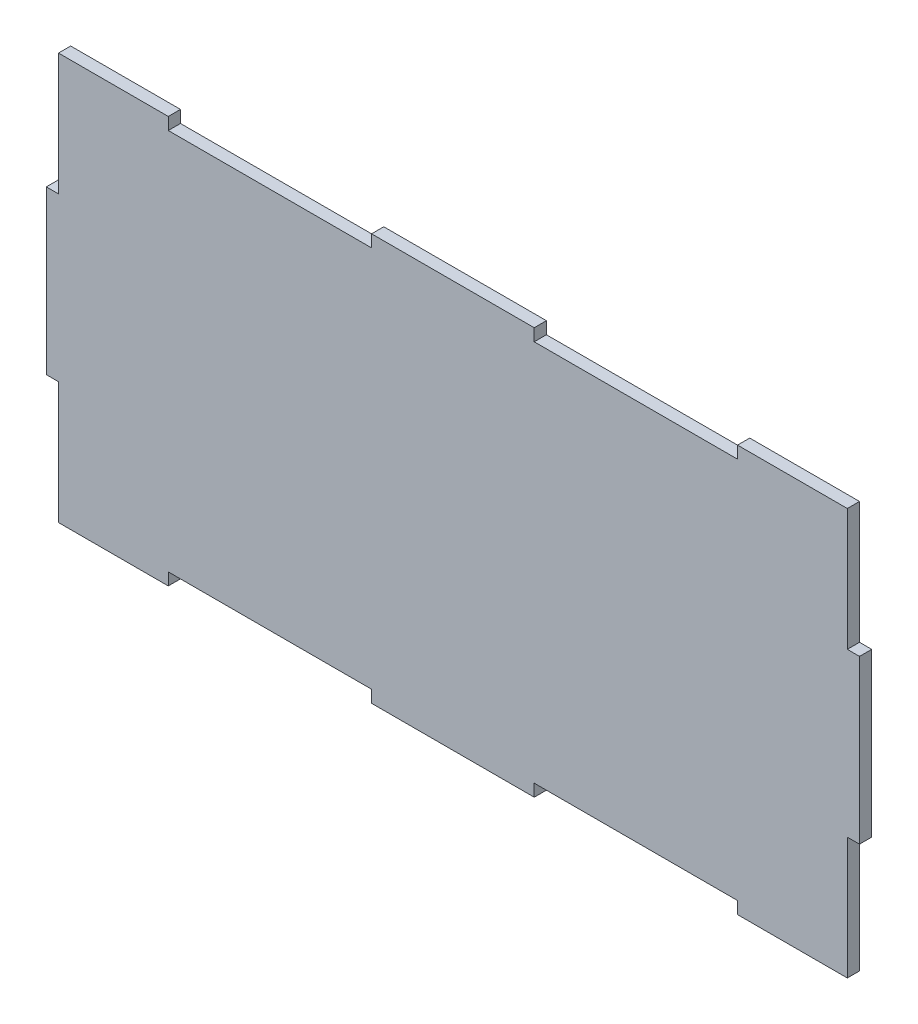
ISO-10303-21;
HEADER;
FILE_DESCRIPTION(('STEP AP214'),'2;1');
FILE_NAME('part.step','',(''),(''),'','','');
FILE_SCHEMA(('AUTOMOTIVE_DESIGN { 1 0 10303 214 1 1 1 1 }'));
ENDSEC;
DATA;
#1=APPLICATION_CONTEXT('core data for automotive mechanical design processes');
#2=APPLICATION_PROTOCOL_DEFINITION('international standard','automotive_design',2000,#1);
#3=PRODUCT_CONTEXT('',#1,'mechanical');
#4=PRODUCT('Part','Part','',(#3));
#5=PRODUCT_RELATED_PRODUCT_CATEGORY('part','',(#4));
#6=PRODUCT_DEFINITION_FORMATION('','',#4);
#7=PRODUCT_DEFINITION_CONTEXT('part definition',#1,'design');
#8=PRODUCT_DEFINITION('design','',#6,#7);
#9=PRODUCT_DEFINITION_SHAPE('','',#8);
#10=(LENGTH_UNIT() NAMED_UNIT(*) SI_UNIT(.MILLI.,.METRE.));
#11=(NAMED_UNIT(*) PLANE_ANGLE_UNIT() SI_UNIT($,.RADIAN.));
#12=(NAMED_UNIT(*) SI_UNIT($,.STERADIAN.) SOLID_ANGLE_UNIT());
#13=UNCERTAINTY_MEASURE_WITH_UNIT(LENGTH_MEASURE(1.E-05),#10,'distance_accuracy_value','');
#14=(GEOMETRIC_REPRESENTATION_CONTEXT(3) GLOBAL_UNCERTAINTY_ASSIGNED_CONTEXT((#13)) GLOBAL_UNIT_ASSIGNED_CONTEXT((#10,
#11,#12)) REPRESENTATION_CONTEXT('',''));
#15=CARTESIAN_POINT('',(0.,0.,0.));
#16=DIRECTION('',(0.,0.,1.));
#17=DIRECTION('',(1.,0.,0.));
#18=AXIS2_PLACEMENT_3D('',#15,#16,#17);
#19=CARTESIAN_POINT('',(-23.0361048653971,9.1911134646746,3.));
#20=DIRECTION('',(-1.,0.,0.));
#21=DIRECTION('',(0.,0.,1.));
#22=AXIS2_PLACEMENT_3D('',#19,#20,#21);
#23=PLANE('',#22);
#24=DIRECTION('',(0.,1.,0.));
#25=VECTOR('',#24,1.);
#26=CARTESIAN_POINT('',(-23.0361048653971,9.1911134646746,0.));
#27=LINE('',#26,#25);
#28=CARTESIAN_POINT('',(-23.0361048653971,6.1911134646746,0.));
#29=VERTEX_POINT('',#28);
#30=CARTESIAN_POINT('',(-23.0361048653971,9.1911134646746,0.));
#31=VERTEX_POINT('',#30);
#32=EDGE_CURVE('E249',#29,#31,#27,.T.);
#33=ORIENTED_EDGE('',*,*,#32,.T.);
#34=DIRECTION('',(0.,0.,-1.));
#35=VECTOR('',#34,1.);
#36=CARTESIAN_POINT('',(-23.0361048653971,9.1911134646746,3.));
#37=LINE('',#36,#35);
#38=CARTESIAN_POINT('',(-23.0361048653971,9.1911134646746,3.));
#39=VERTEX_POINT('',#38);
#40=EDGE_CURVE('E11',#39,#31,#37,.T.);
#41=ORIENTED_EDGE('',*,*,#40,.F.);
#42=DIRECTION('',(0.,1.,0.));
#43=VECTOR('',#42,1.);
#44=CARTESIAN_POINT('',(-23.0361048653971,9.1911134646746,3.));
#45=LINE('',#44,#43);
#46=CARTESIAN_POINT('',(-23.0361048653971,6.1911134646746,3.));
#47=VERTEX_POINT('',#46);
#48=EDGE_CURVE('E303',#47,#39,#45,.T.);
#49=ORIENTED_EDGE('',*,*,#48,.F.);
#50=DIRECTION('',(0.,0.,-1.));
#51=VECTOR('',#50,1.);
#52=CARTESIAN_POINT('',(-23.0361048653971,6.1911134646746,3.));
#53=LINE('',#52,#51);
#54=EDGE_CURVE('E245',#47,#29,#53,.T.);
#55=ORIENTED_EDGE('',*,*,#54,.T.);
#56=EDGE_LOOP('',(#33,#41,#49,#55));
#57=FACE_BOUND('',#56,.T.);
#58=ADVANCED_FACE('F33',(#57),#23,.F.);
#59=CARTESIAN_POINT('',(-50.0361048653972,9.1911134646746,3.));
#60=DIRECTION('',(0.,-1.,0.));
#61=DIRECTION('',(1.,0.,0.));
#62=AXIS2_PLACEMENT_3D('',#59,#60,#61);
#63=PLANE('',#62);
#64=DIRECTION('',(-1.,0.,0.));
#65=VECTOR('',#64,1.);
#66=CARTESIAN_POINT('',(-50.0361048653972,9.1911134646746,0.));
#67=LINE('',#66,#65);
#68=CARTESIAN_POINT('',(-50.0361048653972,9.1911134646746,0.));
#69=VERTEX_POINT('',#68);
#70=EDGE_CURVE('E252',#31,#69,#67,.T.);
#71=ORIENTED_EDGE('',*,*,#70,.T.);
#72=DIRECTION('',(0.,0.,-1.));
#73=VECTOR('',#72,1.);
#74=CARTESIAN_POINT('',(-50.0361048653972,9.1911134646746,3.));
#75=LINE('',#74,#73);
#76=CARTESIAN_POINT('',(-50.0361048653972,9.1911134646746,3.));
#77=VERTEX_POINT('',#76);
#78=EDGE_CURVE('E41',#77,#69,#75,.T.);
#79=ORIENTED_EDGE('',*,*,#78,.F.);
#80=DIRECTION('',(-1.,0.,0.));
#81=VECTOR('',#80,1.);
#82=CARTESIAN_POINT('',(-50.0361048653972,9.1911134646746,3.));
#83=LINE('',#82,#81);
#84=EDGE_CURVE('E152',#39,#77,#83,.T.);
#85=ORIENTED_EDGE('',*,*,#84,.F.);
#86=ORIENTED_EDGE('',*,*,#40,.T.);
#87=EDGE_LOOP('',(#71,#79,#85,#86));
#88=FACE_BOUND('',#87,.T.);
#89=ADVANCED_FACE('F461',(#88),#63,.F.);
#90=CARTESIAN_POINT('',(-50.0361048653972,9.1911134646746,3.));
#91=DIRECTION('',(1.,0.,0.));
#92=DIRECTION('',(0.,0.,-1.));
#93=AXIS2_PLACEMENT_3D('',#90,#91,#92);
#94=PLANE('',#93);
#95=DIRECTION('',(0.,-1.,0.));
#96=VECTOR('',#95,1.);
#97=CARTESIAN_POINT('',(-50.0361048653972,9.1911134646746,0.));
#98=LINE('',#97,#96);
#99=CARTESIAN_POINT('',(-50.0361048653972,-20.8088865353254,0.));
#100=VERTEX_POINT('',#99);
#101=EDGE_CURVE('E254',#69,#100,#98,.T.);
#102=ORIENTED_EDGE('',*,*,#101,.T.);
#103=DIRECTION('',(0.,0.,-1.));
#104=VECTOR('',#103,1.);
#105=CARTESIAN_POINT('',(-50.0361048653972,-20.8088865353254,3.));
#106=LINE('',#105,#104);
#107=CARTESIAN_POINT('',(-50.0361048653972,-20.8088865353254,3.));
#108=VERTEX_POINT('',#107);
#109=EDGE_CURVE('E370',#108,#100,#106,.T.);
#110=ORIENTED_EDGE('',*,*,#109,.F.);
#111=DIRECTION('',(0.,-1.,0.));
#112=VECTOR('',#111,1.);
#113=CARTESIAN_POINT('',(-50.0361048653972,9.1911134646746,3.));
#114=LINE('',#113,#112);
#115=EDGE_CURVE('E378',#77,#108,#114,.T.);
#116=ORIENTED_EDGE('',*,*,#115,.F.);
#117=ORIENTED_EDGE('',*,*,#78,.T.);
#118=EDGE_LOOP('',(#102,#110,#116,#117));
#119=FACE_BOUND('',#118,.T.);
#120=ADVANCED_FACE('F376',(#119),#94,.F.);
#121=CARTESIAN_POINT('',(-50.0361048653972,-20.8088865353254,3.));
#122=DIRECTION('',(0.,-1.,0.));
#123=DIRECTION('',(0.,0.,-1.));
#124=AXIS2_PLACEMENT_3D('',#121,#122,#123);
#125=PLANE('',#124);
#126=DIRECTION('',(-1.,0.,0.));
#127=VECTOR('',#126,1.);
#128=CARTESIAN_POINT('',(-50.0361048653972,-20.8088865353254,0.));
#129=LINE('',#128,#127);
#130=CARTESIAN_POINT('',(-53.0361048653972,-20.8088865353254,0.));
#131=VERTEX_POINT('',#130);
#132=EDGE_CURVE('E256',#100,#131,#129,.T.);
#133=ORIENTED_EDGE('',*,*,#132,.T.);
#134=DIRECTION('',(0.,0.,-1.));
#135=VECTOR('',#134,1.);
#136=CARTESIAN_POINT('',(-53.0361048653972,-20.8088865353254,3.));
#137=LINE('',#136,#135);
#138=CARTESIAN_POINT('',(-53.0361048653972,-20.8088865353254,3.));
#139=VERTEX_POINT('',#138);
#140=EDGE_CURVE('E367',#139,#131,#137,.T.);
#141=ORIENTED_EDGE('',*,*,#140,.F.);
#142=DIRECTION('',(-1.,0.,0.));
#143=VECTOR('',#142,1.);
#144=CARTESIAN_POINT('',(-50.0361048653972,-20.8088865353254,3.));
#145=LINE('',#144,#143);
#146=EDGE_CURVE('E396',#108,#139,#145,.T.);
#147=ORIENTED_EDGE('',*,*,#146,.F.);
#148=ORIENTED_EDGE('',*,*,#109,.T.);
#149=EDGE_LOOP('',(#133,#141,#147,#148));
#150=FACE_BOUND('',#149,.T.);
#151=ADVANCED_FACE('F387',(#150),#125,.F.);
#152=CARTESIAN_POINT('',(-53.0361048653972,-20.8088865353254,3.));
#153=DIRECTION('',(1.,0.,0.));
#154=DIRECTION('',(0.,0.,-1.));
#155=AXIS2_PLACEMENT_3D('',#152,#153,#154);
#156=PLANE('',#155);
#157=DIRECTION('',(0.,-1.,0.));
#158=VECTOR('',#157,1.);
#159=CARTESIAN_POINT('',(-53.0361048653972,-20.8088865353254,0.));
#160=LINE('',#159,#158);
#161=CARTESIAN_POINT('',(-53.0361048653972,-60.8088865353254,0.));
#162=VERTEX_POINT('',#161);
#163=EDGE_CURVE('E258',#131,#162,#160,.T.);
#164=ORIENTED_EDGE('',*,*,#163,.T.);
#165=DIRECTION('',(0.,0.,-1.));
#166=VECTOR('',#165,1.);
#167=CARTESIAN_POINT('',(-53.0361048653972,-60.8088865353254,3.));
#168=LINE('',#167,#166);
#169=CARTESIAN_POINT('',(-53.0361048653972,-60.8088865353254,3.));
#170=VERTEX_POINT('',#169);
#171=EDGE_CURVE('E364',#170,#162,#168,.T.);
#172=ORIENTED_EDGE('',*,*,#171,.F.);
#173=DIRECTION('',(0.,-1.,0.));
#174=VECTOR('',#173,1.);
#175=CARTESIAN_POINT('',(-53.0361048653972,-20.8088865353254,3.));
#176=LINE('',#175,#174);
#177=EDGE_CURVE('E393',#139,#170,#176,.T.);
#178=ORIENTED_EDGE('',*,*,#177,.F.);
#179=ORIENTED_EDGE('',*,*,#140,.T.);
#180=EDGE_LOOP('',(#164,#172,#178,#179));
#181=FACE_BOUND('',#180,.T.);
#182=ADVANCED_FACE('F391',(#181),#156,.F.);
#183=CARTESIAN_POINT('',(-53.0361048653972,-60.8088865353254,3.));
#184=DIRECTION('',(0.,1.,0.));
#185=DIRECTION('',(0.,0.,1.));
#186=AXIS2_PLACEMENT_3D('',#183,#184,#185);
#187=PLANE('',#186);
#188=DIRECTION('',(1.,0.,0.));
#189=VECTOR('',#188,1.);
#190=CARTESIAN_POINT('',(-53.0361048653972,-60.8088865353254,0.));
#191=LINE('',#190,#189);
#192=CARTESIAN_POINT('',(-50.0361048653972,-60.8088865353254,0.));
#193=VERTEX_POINT('',#192);
#194=EDGE_CURVE('E260',#162,#193,#191,.T.);
#195=ORIENTED_EDGE('',*,*,#194,.T.);
#196=DIRECTION('',(0.,0.,-1.));
#197=VECTOR('',#196,1.);
#198=CARTESIAN_POINT('',(-50.0361048653972,-60.8088865353254,3.));
#199=LINE('',#198,#197);
#200=CARTESIAN_POINT('',(-50.0361048653972,-60.8088865353254,3.));
#201=VERTEX_POINT('',#200);
#202=EDGE_CURVE('E361',#201,#193,#199,.T.);
#203=ORIENTED_EDGE('',*,*,#202,.F.);
#204=DIRECTION('',(1.,0.,0.));
#205=VECTOR('',#204,1.);
#206=CARTESIAN_POINT('',(-53.0361048653972,-60.8088865353254,3.));
#207=LINE('',#206,#205);
#208=EDGE_CURVE('E395',#170,#201,#207,.T.);
#209=ORIENTED_EDGE('',*,*,#208,.F.);
#210=ORIENTED_EDGE('',*,*,#171,.T.);
#211=EDGE_LOOP('',(#195,#203,#209,#210));
#212=FACE_BOUND('',#211,.T.);
#213=ADVANCED_FACE('F474',(#212),#187,.F.);
#214=CARTESIAN_POINT('',(-50.0361048653972,-60.8088865353254,3.));
#215=DIRECTION('',(1.,0.,0.));
#216=DIRECTION('',(0.,1.,0.));
#217=AXIS2_PLACEMENT_3D('',#214,#215,#216);
#218=PLANE('',#217);
#219=DIRECTION('',(0.,-1.,0.));
#220=VECTOR('',#219,1.);
#221=CARTESIAN_POINT('',(-50.0361048653972,-60.8088865353254,0.));
#222=LINE('',#221,#220);
#223=CARTESIAN_POINT('',(-50.0361048653972,-90.8088865353254,0.));
#224=VERTEX_POINT('',#223);
#225=EDGE_CURVE('E262',#193,#224,#222,.T.);
#226=ORIENTED_EDGE('',*,*,#225,.T.);
#227=DIRECTION('',(0.,0.,-1.));
#228=VECTOR('',#227,1.);
#229=CARTESIAN_POINT('',(-50.0361048653972,-90.8088865353254,3.));
#230=LINE('',#229,#228);
#231=CARTESIAN_POINT('',(-50.0361048653972,-90.8088865353254,3.));
#232=VERTEX_POINT('',#231);
#233=EDGE_CURVE('E358',#232,#224,#230,.T.);
#234=ORIENTED_EDGE('',*,*,#233,.F.);
#235=DIRECTION('',(0.,-1.,0.));
#236=VECTOR('',#235,1.);
#237=CARTESIAN_POINT('',(-50.0361048653972,-60.8088865353254,3.));
#238=LINE('',#237,#236);
#239=EDGE_CURVE('E398',#201,#232,#238,.T.);
#240=ORIENTED_EDGE('',*,*,#239,.F.);
#241=ORIENTED_EDGE('',*,*,#202,.T.);
#242=EDGE_LOOP('',(#226,#234,#240,#241));
#243=FACE_BOUND('',#242,.T.);
#244=ADVANCED_FACE('F477',(#243),#218,.F.);
#245=CARTESIAN_POINT('',(-50.0361048653972,-90.8088865353254,3.));
#246=DIRECTION('',(0.,1.,0.));
#247=DIRECTION('',(0.,0.,1.));
#248=AXIS2_PLACEMENT_3D('',#245,#246,#247);
#249=PLANE('',#248);
#250=DIRECTION('',(1.,0.,0.));
#251=VECTOR('',#250,1.);
#252=CARTESIAN_POINT('',(-50.0361048653972,-90.8088865353254,0.));
#253=LINE('',#252,#251);
#254=CARTESIAN_POINT('',(-23.0361048653971,-90.8088865353254,0.));
#255=VERTEX_POINT('',#254);
#256=EDGE_CURVE('E264',#224,#255,#253,.T.);
#257=ORIENTED_EDGE('',*,*,#256,.T.);
#258=DIRECTION('',(0.,0.,-1.));
#259=VECTOR('',#258,1.);
#260=CARTESIAN_POINT('',(-23.0361048653971,-90.8088865353254,3.));
#261=LINE('',#260,#259);
#262=CARTESIAN_POINT('',(-23.0361048653971,-90.8088865353254,3.));
#263=VERTEX_POINT('',#262);
#264=EDGE_CURVE('E355',#263,#255,#261,.T.);
#265=ORIENTED_EDGE('',*,*,#264,.F.);
#266=DIRECTION('',(1.,0.,0.));
#267=VECTOR('',#266,1.);
#268=CARTESIAN_POINT('',(-50.0361048653972,-90.8088865353254,3.));
#269=LINE('',#268,#267);
#270=EDGE_CURVE('E404',#232,#263,#269,.T.);
#271=ORIENTED_EDGE('',*,*,#270,.F.);
#272=ORIENTED_EDGE('',*,*,#233,.T.);
#273=EDGE_LOOP('',(#257,#265,#271,#272));
#274=FACE_BOUND('',#273,.T.);
#275=ADVANCED_FACE('F481',(#274),#249,.F.);
#276=CARTESIAN_POINT('',(-23.0361048653971,-90.8088865353254,3.));
#277=DIRECTION('',(-1.,0.,0.));
#278=DIRECTION('',(0.,0.,1.));
#279=AXIS2_PLACEMENT_3D('',#276,#277,#278);
#280=PLANE('',#279);
#281=DIRECTION('',(0.,1.,0.));
#282=VECTOR('',#281,1.);
#283=CARTESIAN_POINT('',(-23.0361048653971,-90.8088865353254,0.));
#284=LINE('',#283,#282);
#285=CARTESIAN_POINT('',(-23.0361048653971,-87.8088865353254,0.));
#286=VERTEX_POINT('',#285);
#287=EDGE_CURVE('E266',#255,#286,#284,.T.);
#288=ORIENTED_EDGE('',*,*,#287,.T.);
#289=DIRECTION('',(0.,0.,-1.));
#290=VECTOR('',#289,1.);
#291=CARTESIAN_POINT('',(-23.0361048653971,-87.8088865353254,3.));
#292=LINE('',#291,#290);
#293=CARTESIAN_POINT('',(-23.0361048653971,-87.8088865353254,3.));
#294=VERTEX_POINT('',#293);
#295=EDGE_CURVE('E352',#294,#286,#292,.T.);
#296=ORIENTED_EDGE('',*,*,#295,.F.);
#297=DIRECTION('',(0.,1.,0.));
#298=VECTOR('',#297,1.);
#299=CARTESIAN_POINT('',(-23.0361048653971,-90.8088865353254,3.));
#300=LINE('',#299,#298);
#301=EDGE_CURVE('E406',#263,#294,#300,.T.);
#302=ORIENTED_EDGE('',*,*,#301,.F.);
#303=ORIENTED_EDGE('',*,*,#264,.T.);
#304=EDGE_LOOP('',(#288,#296,#302,#303));
#305=FACE_BOUND('',#304,.T.);
#306=ADVANCED_FACE('F485',(#305),#280,.F.);
#307=CARTESIAN_POINT('',(-23.0361048653971,-87.8088865353254,3.));
#308=DIRECTION('',(0.,1.,0.));
#309=DIRECTION('',(0.,0.,1.));
#310=AXIS2_PLACEMENT_3D('',#307,#308,#309);
#311=PLANE('',#310);
#312=DIRECTION('',(1.,0.,0.));
#313=VECTOR('',#312,1.);
#314=CARTESIAN_POINT('',(-23.0361048653971,-87.8088865353254,0.));
#315=LINE('',#314,#313);
#316=CARTESIAN_POINT('',(26.9638951346029,-87.8088865353254,0.));
#317=VERTEX_POINT('',#316);
#318=EDGE_CURVE('E268',#286,#317,#315,.T.);
#319=ORIENTED_EDGE('',*,*,#318,.T.);
#320=DIRECTION('',(0.,0.,-1.));
#321=VECTOR('',#320,1.);
#322=CARTESIAN_POINT('',(26.9638951346029,-87.8088865353254,3.));
#323=LINE('',#322,#321);
#324=CARTESIAN_POINT('',(26.9638951346029,-87.8088865353254,3.));
#325=VERTEX_POINT('',#324);
#326=EDGE_CURVE('E349',#325,#317,#323,.T.);
#327=ORIENTED_EDGE('',*,*,#326,.F.);
#328=DIRECTION('',(1.,0.,0.));
#329=VECTOR('',#328,1.);
#330=CARTESIAN_POINT('',(-23.0361048653971,-87.8088865353254,3.));
#331=LINE('',#330,#329);
#332=EDGE_CURVE('E408',#294,#325,#331,.T.);
#333=ORIENTED_EDGE('',*,*,#332,.F.);
#334=ORIENTED_EDGE('',*,*,#295,.T.);
#335=EDGE_LOOP('',(#319,#327,#333,#334));
#336=FACE_BOUND('',#335,.T.);
#337=ADVANCED_FACE('F489',(#336),#311,.F.);
#338=CARTESIAN_POINT('',(26.9638951346029,-90.8088865353254,3.));
#339=DIRECTION('',(1.,0.,0.));
#340=DIRECTION('',(0.,0.,-1.));
#341=AXIS2_PLACEMENT_3D('',#338,#339,#340);
#342=PLANE('',#341);
#343=DIRECTION('',(0.,-1.,0.));
#344=VECTOR('',#343,1.);
#345=CARTESIAN_POINT('',(26.9638951346029,-90.8088865353254,0.));
#346=LINE('',#345,#344);
#347=CARTESIAN_POINT('',(26.9638951346029,-90.8088865353254,0.));
#348=VERTEX_POINT('',#347);
#349=EDGE_CURVE('E270',#317,#348,#346,.T.);
#350=ORIENTED_EDGE('',*,*,#349,.T.);
#351=DIRECTION('',(0.,0.,-1.));
#352=VECTOR('',#351,1.);
#353=CARTESIAN_POINT('',(26.9638951346029,-90.8088865353254,3.));
#354=LINE('',#353,#352);
#355=CARTESIAN_POINT('',(26.9638951346029,-90.8088865353254,3.));
#356=VERTEX_POINT('',#355);
#357=EDGE_CURVE('E346',#356,#348,#354,.T.);
#358=ORIENTED_EDGE('',*,*,#357,.F.);
#359=DIRECTION('',(0.,-1.,0.));
#360=VECTOR('',#359,1.);
#361=CARTESIAN_POINT('',(26.9638951346029,-90.8088865353254,3.));
#362=LINE('',#361,#360);
#363=EDGE_CURVE('E410',#325,#356,#362,.T.);
#364=ORIENTED_EDGE('',*,*,#363,.F.);
#365=ORIENTED_EDGE('',*,*,#326,.T.);
#366=EDGE_LOOP('',(#350,#358,#364,#365));
#367=FACE_BOUND('',#366,.T.);
#368=ADVANCED_FACE('F493',(#367),#342,.F.);
#369=CARTESIAN_POINT('',(26.9638951346029,-90.8088865353254,3.));
#370=DIRECTION('',(0.,1.,0.));
#371=DIRECTION('',(0.,0.,1.));
#372=AXIS2_PLACEMENT_3D('',#369,#370,#371);
#373=PLANE('',#372);
#374=DIRECTION('',(1.,0.,0.));
#375=VECTOR('',#374,1.);
#376=CARTESIAN_POINT('',(26.9638951346029,-90.8088865353254,0.));
#377=LINE('',#376,#375);
#378=CARTESIAN_POINT('',(66.9638951346029,-90.8088865353254,0.));
#379=VERTEX_POINT('',#378);
#380=EDGE_CURVE('E272',#348,#379,#377,.T.);
#381=ORIENTED_EDGE('',*,*,#380,.T.);
#382=DIRECTION('',(0.,0.,-1.));
#383=VECTOR('',#382,1.);
#384=CARTESIAN_POINT('',(66.9638951346029,-90.8088865353254,3.));
#385=LINE('',#384,#383);
#386=CARTESIAN_POINT('',(66.9638951346029,-90.8088865353254,3.));
#387=VERTEX_POINT('',#386);
#388=EDGE_CURVE('E343',#387,#379,#385,.T.);
#389=ORIENTED_EDGE('',*,*,#388,.F.);
#390=DIRECTION('',(1.,0.,0.));
#391=VECTOR('',#390,1.);
#392=CARTESIAN_POINT('',(26.9638951346029,-90.8088865353254,3.));
#393=LINE('',#392,#391);
#394=EDGE_CURVE('E412',#356,#387,#393,.T.);
#395=ORIENTED_EDGE('',*,*,#394,.F.);
#396=ORIENTED_EDGE('',*,*,#357,.T.);
#397=EDGE_LOOP('',(#381,#389,#395,#396));
#398=FACE_BOUND('',#397,.T.);
#399=ADVANCED_FACE('F497',(#398),#373,.F.);
#400=CARTESIAN_POINT('',(66.9638951346029,-90.8088865353254,3.));
#401=DIRECTION('',(-1.,0.,0.));
#402=DIRECTION('',(0.,0.,1.));
#403=AXIS2_PLACEMENT_3D('',#400,#401,#402);
#404=PLANE('',#403);
#405=DIRECTION('',(0.,1.,0.));
#406=VECTOR('',#405,1.);
#407=CARTESIAN_POINT('',(66.9638951346029,-90.8088865353254,0.));
#408=LINE('',#407,#406);
#409=CARTESIAN_POINT('',(66.9638951346029,-87.8088865353254,0.));
#410=VERTEX_POINT('',#409);
#411=EDGE_CURVE('E274',#379,#410,#408,.T.);
#412=ORIENTED_EDGE('',*,*,#411,.T.);
#413=DIRECTION('',(0.,0.,-1.));
#414=VECTOR('',#413,1.);
#415=CARTESIAN_POINT('',(66.9638951346029,-87.8088865353254,3.));
#416=LINE('',#415,#414);
#417=CARTESIAN_POINT('',(66.9638951346029,-87.8088865353254,3.));
#418=VERTEX_POINT('',#417);
#419=EDGE_CURVE('E340',#418,#410,#416,.T.);
#420=ORIENTED_EDGE('',*,*,#419,.F.);
#421=DIRECTION('',(0.,1.,0.));
#422=VECTOR('',#421,1.);
#423=CARTESIAN_POINT('',(66.9638951346029,-90.8088865353254,3.));
#424=LINE('',#423,#422);
#425=EDGE_CURVE('E414',#387,#418,#424,.T.);
#426=ORIENTED_EDGE('',*,*,#425,.F.);
#427=ORIENTED_EDGE('',*,*,#388,.T.);
#428=EDGE_LOOP('',(#412,#420,#426,#427));
#429=FACE_BOUND('',#428,.T.);
#430=ADVANCED_FACE('F501',(#429),#404,.F.);
#431=CARTESIAN_POINT('',(66.9638951346029,-87.8088865353254,3.));
#432=DIRECTION('',(0.,1.,0.));
#433=DIRECTION('',(0.,0.,1.));
#434=AXIS2_PLACEMENT_3D('',#431,#432,#433);
#435=PLANE('',#434);
#436=DIRECTION('',(1.,0.,0.));
#437=VECTOR('',#436,1.);
#438=CARTESIAN_POINT('',(66.9638951346029,-87.8088865353254,0.));
#439=LINE('',#438,#437);
#440=CARTESIAN_POINT('',(116.963895134603,-87.8088865353254,0.));
#441=VERTEX_POINT('',#440);
#442=EDGE_CURVE('E276',#410,#441,#439,.T.);
#443=ORIENTED_EDGE('',*,*,#442,.T.);
#444=DIRECTION('',(0.,0.,-1.));
#445=VECTOR('',#444,1.);
#446=CARTESIAN_POINT('',(116.963895134603,-87.8088865353254,3.));
#447=LINE('',#446,#445);
#448=CARTESIAN_POINT('',(116.963895134603,-87.8088865353254,3.));
#449=VERTEX_POINT('',#448);
#450=EDGE_CURVE('E337',#449,#441,#447,.T.);
#451=ORIENTED_EDGE('',*,*,#450,.F.);
#452=DIRECTION('',(1.,0.,0.));
#453=VECTOR('',#452,1.);
#454=CARTESIAN_POINT('',(66.9638951346029,-87.8088865353254,3.));
#455=LINE('',#454,#453);
#456=EDGE_CURVE('E416',#418,#449,#455,.T.);
#457=ORIENTED_EDGE('',*,*,#456,.F.);
#458=ORIENTED_EDGE('',*,*,#419,.T.);
#459=EDGE_LOOP('',(#443,#451,#457,#458));
#460=FACE_BOUND('',#459,.T.);
#461=ADVANCED_FACE('F505',(#460),#435,.F.);
#462=CARTESIAN_POINT('',(116.963895134603,-90.8088865353254,3.));
#463=DIRECTION('',(1.,0.,0.));
#464=DIRECTION('',(0.,0.,-1.));
#465=AXIS2_PLACEMENT_3D('',#462,#463,#464);
#466=PLANE('',#465);
#467=DIRECTION('',(0.,-1.,0.));
#468=VECTOR('',#467,1.);
#469=CARTESIAN_POINT('',(116.963895134603,-90.8088865353254,0.));
#470=LINE('',#469,#468);
#471=CARTESIAN_POINT('',(116.963895134603,-90.8088865353254,0.));
#472=VERTEX_POINT('',#471);
#473=EDGE_CURVE('E278',#441,#472,#470,.T.);
#474=ORIENTED_EDGE('',*,*,#473,.T.);
#475=DIRECTION('',(0.,0.,-1.));
#476=VECTOR('',#475,1.);
#477=CARTESIAN_POINT('',(116.963895134603,-90.8088865353254,3.));
#478=LINE('',#477,#476);
#479=CARTESIAN_POINT('',(116.963895134603,-90.8088865353254,3.));
#480=VERTEX_POINT('',#479);
#481=EDGE_CURVE('E334',#480,#472,#478,.T.);
#482=ORIENTED_EDGE('',*,*,#481,.F.);
#483=DIRECTION('',(0.,-1.,0.));
#484=VECTOR('',#483,1.);
#485=CARTESIAN_POINT('',(116.963895134603,-90.8088865353254,3.));
#486=LINE('',#485,#484);
#487=EDGE_CURVE('E418',#449,#480,#486,.T.);
#488=ORIENTED_EDGE('',*,*,#487,.F.);
#489=ORIENTED_EDGE('',*,*,#450,.T.);
#490=EDGE_LOOP('',(#474,#482,#488,#489));
#491=FACE_BOUND('',#490,.T.);
#492=ADVANCED_FACE('F509',(#491),#466,.F.);
#493=CARTESIAN_POINT('',(116.963895134603,-90.8088865353254,3.));
#494=DIRECTION('',(0.,1.,0.));
#495=DIRECTION('',(0.,0.,1.));
#496=AXIS2_PLACEMENT_3D('',#493,#494,#495);
#497=PLANE('',#496);
#498=DIRECTION('',(1.,0.,0.));
#499=VECTOR('',#498,1.);
#500=CARTESIAN_POINT('',(116.963895134603,-90.8088865353254,0.));
#501=LINE('',#500,#499);
#502=CARTESIAN_POINT('',(143.963895134603,-90.8088865353254,0.));
#503=VERTEX_POINT('',#502);
#504=EDGE_CURVE('E280',#472,#503,#501,.T.);
#505=ORIENTED_EDGE('',*,*,#504,.T.);
#506=DIRECTION('',(0.,0.,-1.));
#507=VECTOR('',#506,1.);
#508=CARTESIAN_POINT('',(143.963895134603,-90.8088865353254,3.));
#509=LINE('',#508,#507);
#510=CARTESIAN_POINT('',(143.963895134603,-90.8088865353254,3.));
#511=VERTEX_POINT('',#510);
#512=EDGE_CURVE('E331',#511,#503,#509,.T.);
#513=ORIENTED_EDGE('',*,*,#512,.F.);
#514=DIRECTION('',(1.,0.,0.));
#515=VECTOR('',#514,1.);
#516=CARTESIAN_POINT('',(116.963895134603,-90.8088865353254,3.));
#517=LINE('',#516,#515);
#518=EDGE_CURVE('E420',#480,#511,#517,.T.);
#519=ORIENTED_EDGE('',*,*,#518,.F.);
#520=ORIENTED_EDGE('',*,*,#481,.T.);
#521=EDGE_LOOP('',(#505,#513,#519,#520));
#522=FACE_BOUND('',#521,.T.);
#523=ADVANCED_FACE('F513',(#522),#497,.F.);
#524=CARTESIAN_POINT('',(143.963895134603,-60.8088865353254,3.));
#525=DIRECTION('',(-1.,0.,0.));
#526=DIRECTION('',(0.,0.,1.));
#527=AXIS2_PLACEMENT_3D('',#524,#525,#526);
#528=PLANE('',#527);
#529=DIRECTION('',(0.,1.,0.));
#530=VECTOR('',#529,1.);
#531=CARTESIAN_POINT('',(143.963895134603,-60.8088865353254,0.));
#532=LINE('',#531,#530);
#533=CARTESIAN_POINT('',(143.963895134603,-60.8088865353254,0.));
#534=VERTEX_POINT('',#533);
#535=EDGE_CURVE('E282',#503,#534,#532,.T.);
#536=ORIENTED_EDGE('',*,*,#535,.T.);
#537=DIRECTION('',(0.,0.,-1.));
#538=VECTOR('',#537,1.);
#539=CARTESIAN_POINT('',(143.963895134603,-60.8088865353254,3.));
#540=LINE('',#539,#538);
#541=CARTESIAN_POINT('',(143.963895134603,-60.8088865353254,3.));
#542=VERTEX_POINT('',#541);
#543=EDGE_CURVE('E328',#542,#534,#540,.T.);
#544=ORIENTED_EDGE('',*,*,#543,.F.);
#545=DIRECTION('',(0.,1.,0.));
#546=VECTOR('',#545,1.);
#547=CARTESIAN_POINT('',(143.963895134603,-60.8088865353254,3.));
#548=LINE('',#547,#546);
#549=EDGE_CURVE('E422',#511,#542,#548,.T.);
#550=ORIENTED_EDGE('',*,*,#549,.F.);
#551=ORIENTED_EDGE('',*,*,#512,.T.);
#552=EDGE_LOOP('',(#536,#544,#550,#551));
#553=FACE_BOUND('',#552,.T.);
#554=ADVANCED_FACE('F517',(#553),#528,.F.);
#555=CARTESIAN_POINT('',(146.963895134603,-60.8088865353254,3.));
#556=DIRECTION('',(0.,1.,0.));
#557=DIRECTION('',(0.,0.,1.));
#558=AXIS2_PLACEMENT_3D('',#555,#556,#557);
#559=PLANE('',#558);
#560=DIRECTION('',(1.,0.,0.));
#561=VECTOR('',#560,1.);
#562=CARTESIAN_POINT('',(146.963895134603,-60.8088865353254,0.));
#563=LINE('',#562,#561);
#564=CARTESIAN_POINT('',(146.963895134603,-60.8088865353254,0.));
#565=VERTEX_POINT('',#564);
#566=EDGE_CURVE('E284',#534,#565,#563,.T.);
#567=ORIENTED_EDGE('',*,*,#566,.T.);
#568=DIRECTION('',(0.,0.,-1.));
#569=VECTOR('',#568,1.);
#570=CARTESIAN_POINT('',(146.963895134603,-60.8088865353254,3.));
#571=LINE('',#570,#569);
#572=CARTESIAN_POINT('',(146.963895134603,-60.8088865353254,3.));
#573=VERTEX_POINT('',#572);
#574=EDGE_CURVE('E325',#573,#565,#571,.T.);
#575=ORIENTED_EDGE('',*,*,#574,.F.);
#576=DIRECTION('',(1.,0.,0.));
#577=VECTOR('',#576,1.);
#578=CARTESIAN_POINT('',(146.963895134603,-60.8088865353254,3.));
#579=LINE('',#578,#577);
#580=EDGE_CURVE('E424',#542,#573,#579,.T.);
#581=ORIENTED_EDGE('',*,*,#580,.F.);
#582=ORIENTED_EDGE('',*,*,#543,.T.);
#583=EDGE_LOOP('',(#567,#575,#581,#582));
#584=FACE_BOUND('',#583,.T.);
#585=ADVANCED_FACE('F521',(#584),#559,.F.);
#586=CARTESIAN_POINT('',(146.963895134603,-20.8088865353254,3.));
#587=DIRECTION('',(-1.,0.,0.));
#588=DIRECTION('',(0.,0.,1.));
#589=AXIS2_PLACEMENT_3D('',#586,#587,#588);
#590=PLANE('',#589);
#591=DIRECTION('',(0.,1.,0.));
#592=VECTOR('',#591,1.);
#593=CARTESIAN_POINT('',(146.963895134603,-20.8088865353254,0.));
#594=LINE('',#593,#592);
#595=CARTESIAN_POINT('',(146.963895134603,-20.8088865353254,0.));
#596=VERTEX_POINT('',#595);
#597=EDGE_CURVE('E286',#565,#596,#594,.T.);
#598=ORIENTED_EDGE('',*,*,#597,.T.);
#599=DIRECTION('',(0.,0.,-1.));
#600=VECTOR('',#599,1.);
#601=CARTESIAN_POINT('',(146.963895134603,-20.8088865353254,3.));
#602=LINE('',#601,#600);
#603=CARTESIAN_POINT('',(146.963895134603,-20.8088865353254,3.));
#604=VERTEX_POINT('',#603);
#605=EDGE_CURVE('E322',#604,#596,#602,.T.);
#606=ORIENTED_EDGE('',*,*,#605,.F.);
#607=DIRECTION('',(0.,1.,0.));
#608=VECTOR('',#607,1.);
#609=CARTESIAN_POINT('',(146.963895134603,-20.8088865353254,3.));
#610=LINE('',#609,#608);
#611=EDGE_CURVE('E426',#573,#604,#610,.T.);
#612=ORIENTED_EDGE('',*,*,#611,.F.);
#613=ORIENTED_EDGE('',*,*,#574,.T.);
#614=EDGE_LOOP('',(#598,#606,#612,#613));
#615=FACE_BOUND('',#614,.T.);
#616=ADVANCED_FACE('F525',(#615),#590,.F.);
#617=CARTESIAN_POINT('',(143.963895134603,-20.8088865353254,3.));
#618=DIRECTION('',(0.,-1.,0.));
#619=DIRECTION('',(0.,0.,-1.));
#620=AXIS2_PLACEMENT_3D('',#617,#618,#619);
#621=PLANE('',#620);
#622=DIRECTION('',(-1.,0.,0.));
#623=VECTOR('',#622,1.);
#624=CARTESIAN_POINT('',(143.963895134603,-20.8088865353254,0.));
#625=LINE('',#624,#623);
#626=CARTESIAN_POINT('',(143.963895134603,-20.8088865353254,0.));
#627=VERTEX_POINT('',#626);
#628=EDGE_CURVE('E288',#596,#627,#625,.T.);
#629=ORIENTED_EDGE('',*,*,#628,.T.);
#630=DIRECTION('',(0.,0.,-1.));
#631=VECTOR('',#630,1.);
#632=CARTESIAN_POINT('',(143.963895134603,-20.8088865353254,3.));
#633=LINE('',#632,#631);
#634=CARTESIAN_POINT('',(143.963895134603,-20.8088865353254,3.));
#635=VERTEX_POINT('',#634);
#636=EDGE_CURVE('E319',#635,#627,#633,.T.);
#637=ORIENTED_EDGE('',*,*,#636,.F.);
#638=DIRECTION('',(-1.,0.,0.));
#639=VECTOR('',#638,1.);
#640=CARTESIAN_POINT('',(143.963895134603,-20.8088865353254,3.));
#641=LINE('',#640,#639);
#642=EDGE_CURVE('E428',#604,#635,#641,.T.);
#643=ORIENTED_EDGE('',*,*,#642,.F.);
#644=ORIENTED_EDGE('',*,*,#605,.T.);
#645=EDGE_LOOP('',(#629,#637,#643,#644));
#646=FACE_BOUND('',#645,.T.);
#647=ADVANCED_FACE('F529',(#646),#621,.F.);
#648=CARTESIAN_POINT('',(143.963895134603,9.1911134646746,3.));
#649=DIRECTION('',(-1.,0.,0.));
#650=DIRECTION('',(0.,0.,1.));
#651=AXIS2_PLACEMENT_3D('',#648,#649,#650);
#652=PLANE('',#651);
#653=DIRECTION('',(0.,1.,0.));
#654=VECTOR('',#653,1.);
#655=CARTESIAN_POINT('',(143.963895134603,9.1911134646746,0.));
#656=LINE('',#655,#654);
#657=CARTESIAN_POINT('',(143.963895134603,9.1911134646746,0.));
#658=VERTEX_POINT('',#657);
#659=EDGE_CURVE('E290',#627,#658,#656,.T.);
#660=ORIENTED_EDGE('',*,*,#659,.T.);
#661=DIRECTION('',(0.,0.,-1.));
#662=VECTOR('',#661,1.);
#663=CARTESIAN_POINT('',(143.963895134603,9.1911134646746,3.));
#664=LINE('',#663,#662);
#665=CARTESIAN_POINT('',(143.963895134603,9.1911134646746,3.));
#666=VERTEX_POINT('',#665);
#667=EDGE_CURVE('E316',#666,#658,#664,.T.);
#668=ORIENTED_EDGE('',*,*,#667,.F.);
#669=DIRECTION('',(0.,1.,0.));
#670=VECTOR('',#669,1.);
#671=CARTESIAN_POINT('',(143.963895134603,9.1911134646746,3.));
#672=LINE('',#671,#670);
#673=EDGE_CURVE('E430',#635,#666,#672,.T.);
#674=ORIENTED_EDGE('',*,*,#673,.F.);
#675=ORIENTED_EDGE('',*,*,#636,.T.);
#676=EDGE_LOOP('',(#660,#668,#674,#675));
#677=FACE_BOUND('',#676,.T.);
#678=ADVANCED_FACE('F533',(#677),#652,.F.);
#679=CARTESIAN_POINT('',(116.963895134603,9.1911134646746,3.));
#680=DIRECTION('',(0.,-1.,0.));
#681=DIRECTION('',(0.,0.,-1.));
#682=AXIS2_PLACEMENT_3D('',#679,#680,#681);
#683=PLANE('',#682);
#684=DIRECTION('',(-1.,0.,0.));
#685=VECTOR('',#684,1.);
#686=CARTESIAN_POINT('',(116.963895134603,9.1911134646746,0.));
#687=LINE('',#686,#685);
#688=CARTESIAN_POINT('',(116.963895134603,9.1911134646746,0.));
#689=VERTEX_POINT('',#688);
#690=EDGE_CURVE('E292',#658,#689,#687,.T.);
#691=ORIENTED_EDGE('',*,*,#690,.T.);
#692=DIRECTION('',(0.,0.,-1.));
#693=VECTOR('',#692,1.);
#694=CARTESIAN_POINT('',(116.963895134603,9.1911134646746,3.));
#695=LINE('',#694,#693);
#696=CARTESIAN_POINT('',(116.963895134603,9.1911134646746,3.));
#697=VERTEX_POINT('',#696);
#698=EDGE_CURVE('E313',#697,#689,#695,.T.);
#699=ORIENTED_EDGE('',*,*,#698,.F.);
#700=DIRECTION('',(-1.,0.,0.));
#701=VECTOR('',#700,1.);
#702=CARTESIAN_POINT('',(116.963895134603,9.1911134646746,3.));
#703=LINE('',#702,#701);
#704=EDGE_CURVE('E432',#666,#697,#703,.T.);
#705=ORIENTED_EDGE('',*,*,#704,.F.);
#706=ORIENTED_EDGE('',*,*,#667,.T.);
#707=EDGE_LOOP('',(#691,#699,#705,#706));
#708=FACE_BOUND('',#707,.T.);
#709=ADVANCED_FACE('F537',(#708),#683,.F.);
#710=CARTESIAN_POINT('',(116.963895134603,9.1911134646746,3.));
#711=DIRECTION('',(1.,0.,0.));
#712=DIRECTION('',(0.,0.,-1.));
#713=AXIS2_PLACEMENT_3D('',#710,#711,#712);
#714=PLANE('',#713);
#715=DIRECTION('',(0.,-1.,0.));
#716=VECTOR('',#715,1.);
#717=CARTESIAN_POINT('',(116.963895134603,9.1911134646746,0.));
#718=LINE('',#717,#716);
#719=CARTESIAN_POINT('',(116.963895134603,6.1911134646746,0.));
#720=VERTEX_POINT('',#719);
#721=EDGE_CURVE('E294',#689,#720,#718,.T.);
#722=ORIENTED_EDGE('',*,*,#721,.T.);
#723=DIRECTION('',(0.,0.,-1.));
#724=VECTOR('',#723,1.);
#725=CARTESIAN_POINT('',(116.963895134603,6.1911134646746,3.));
#726=LINE('',#725,#724);
#727=CARTESIAN_POINT('',(116.963895134603,6.1911134646746,3.));
#728=VERTEX_POINT('',#727);
#729=EDGE_CURVE('E310',#728,#720,#726,.T.);
#730=ORIENTED_EDGE('',*,*,#729,.F.);
#731=DIRECTION('',(0.,-1.,0.));
#732=VECTOR('',#731,1.);
#733=CARTESIAN_POINT('',(116.963895134603,9.1911134646746,3.));
#734=LINE('',#733,#732);
#735=EDGE_CURVE('E434',#697,#728,#734,.T.);
#736=ORIENTED_EDGE('',*,*,#735,.F.);
#737=ORIENTED_EDGE('',*,*,#698,.T.);
#738=EDGE_LOOP('',(#722,#730,#736,#737));
#739=FACE_BOUND('',#738,.T.);
#740=ADVANCED_FACE('F541',(#739),#714,.F.);
#741=CARTESIAN_POINT('',(66.9638951346029,6.1911134646746,3.));
#742=DIRECTION('',(0.,-1.,0.));
#743=DIRECTION('',(0.,0.,-1.));
#744=AXIS2_PLACEMENT_3D('',#741,#742,#743);
#745=PLANE('',#744);
#746=DIRECTION('',(-1.,0.,0.));
#747=VECTOR('',#746,1.);
#748=CARTESIAN_POINT('',(66.9638951346029,6.1911134646746,0.));
#749=LINE('',#748,#747);
#750=CARTESIAN_POINT('',(66.9638951346029,6.1911134646746,0.));
#751=VERTEX_POINT('',#750);
#752=EDGE_CURVE('E296',#720,#751,#749,.T.);
#753=ORIENTED_EDGE('',*,*,#752,.T.);
#754=DIRECTION('',(0.,0.,-1.));
#755=VECTOR('',#754,1.);
#756=CARTESIAN_POINT('',(66.9638951346029,6.1911134646746,3.));
#757=LINE('',#756,#755);
#758=CARTESIAN_POINT('',(66.9638951346029,6.1911134646746,3.));
#759=VERTEX_POINT('',#758);
#760=EDGE_CURVE('E307',#759,#751,#757,.T.);
#761=ORIENTED_EDGE('',*,*,#760,.F.);
#762=DIRECTION('',(-1.,0.,0.));
#763=VECTOR('',#762,1.);
#764=CARTESIAN_POINT('',(66.9638951346029,6.1911134646746,3.));
#765=LINE('',#764,#763);
#766=EDGE_CURVE('E436',#728,#759,#765,.T.);
#767=ORIENTED_EDGE('',*,*,#766,.F.);
#768=ORIENTED_EDGE('',*,*,#729,.T.);
#769=EDGE_LOOP('',(#753,#761,#767,#768));
#770=FACE_BOUND('',#769,.T.);
#771=ADVANCED_FACE('F442',(#770),#745,.F.);
#772=CARTESIAN_POINT('',(66.9638951346029,9.1911134646746,3.));
#773=DIRECTION('',(-1.,0.,0.));
#774=DIRECTION('',(0.,0.,1.));
#775=AXIS2_PLACEMENT_3D('',#772,#773,#774);
#776=PLANE('',#775);
#777=DIRECTION('',(0.,1.,0.));
#778=VECTOR('',#777,1.);
#779=CARTESIAN_POINT('',(66.9638951346029,9.1911134646746,0.));
#780=LINE('',#779,#778);
#781=CARTESIAN_POINT('',(66.9638951346029,9.1911134646746,0.));
#782=VERTEX_POINT('',#781);
#783=EDGE_CURVE('E298',#751,#782,#780,.T.);
#784=ORIENTED_EDGE('',*,*,#783,.T.);
#785=DIRECTION('',(0.,0.,-1.));
#786=VECTOR('',#785,1.);
#787=CARTESIAN_POINT('',(66.9638951346029,9.1911134646746,3.));
#788=LINE('',#787,#786);
#789=CARTESIAN_POINT('',(66.9638951346029,9.1911134646746,3.));
#790=VERTEX_POINT('',#789);
#791=EDGE_CURVE('E240',#790,#782,#788,.T.);
#792=ORIENTED_EDGE('',*,*,#791,.F.);
#793=DIRECTION('',(0.,1.,0.));
#794=VECTOR('',#793,1.);
#795=CARTESIAN_POINT('',(66.9638951346029,9.1911134646746,3.));
#796=LINE('',#795,#794);
#797=EDGE_CURVE('E231',#759,#790,#796,.T.);
#798=ORIENTED_EDGE('',*,*,#797,.F.);
#799=ORIENTED_EDGE('',*,*,#760,.T.);
#800=EDGE_LOOP('',(#784,#792,#798,#799));
#801=FACE_BOUND('',#800,.T.);
#802=ADVANCED_FACE('F446',(#801),#776,.F.);
#803=CARTESIAN_POINT('',(26.9638951346029,9.1911134646746,3.));
#804=DIRECTION('',(0.,-1.,0.));
#805=DIRECTION('',(0.,0.,-1.));
#806=AXIS2_PLACEMENT_3D('',#803,#804,#805);
#807=PLANE('',#806);
#808=DIRECTION('',(-1.,0.,0.));
#809=VECTOR('',#808,1.);
#810=CARTESIAN_POINT('',(26.9638951346029,9.1911134646746,0.));
#811=LINE('',#810,#809);
#812=CARTESIAN_POINT('',(26.9638951346029,9.1911134646746,0.));
#813=VERTEX_POINT('',#812);
#814=EDGE_CURVE('E239',#782,#813,#811,.T.);
#815=ORIENTED_EDGE('',*,*,#814,.T.);
#816=DIRECTION('',(0.,0.,-1.));
#817=VECTOR('',#816,1.);
#818=CARTESIAN_POINT('',(26.9638951346029,9.1911134646746,3.));
#819=LINE('',#818,#817);
#820=CARTESIAN_POINT('',(26.9638951346029,9.1911134646746,3.));
#821=VERTEX_POINT('',#820);
#822=EDGE_CURVE('E236',#821,#813,#819,.T.);
#823=ORIENTED_EDGE('',*,*,#822,.F.);
#824=DIRECTION('',(-1.,0.,0.));
#825=VECTOR('',#824,1.);
#826=CARTESIAN_POINT('',(26.9638951346029,9.1911134646746,3.));
#827=LINE('',#826,#825);
#828=EDGE_CURVE('E225',#790,#821,#827,.T.);
#829=ORIENTED_EDGE('',*,*,#828,.F.);
#830=ORIENTED_EDGE('',*,*,#791,.T.);
#831=EDGE_LOOP('',(#815,#823,#829,#830));
#832=FACE_BOUND('',#831,.T.);
#833=ADVANCED_FACE('F237',(#832),#807,.F.);
#834=CARTESIAN_POINT('',(26.9638951346029,9.1911134646746,3.));
#835=DIRECTION('',(1.,0.,0.));
#836=DIRECTION('',(0.,0.,-1.));
#837=AXIS2_PLACEMENT_3D('',#834,#835,#836);
#838=PLANE('',#837);
#839=DIRECTION('',(0.,-1.,0.));
#840=VECTOR('',#839,1.);
#841=CARTESIAN_POINT('',(26.9638951346029,9.1911134646746,0.));
#842=LINE('',#841,#840);
#843=CARTESIAN_POINT('',(26.9638951346029,6.1911134646746,0.));
#844=VERTEX_POINT('',#843);
#845=EDGE_CURVE('E138',#813,#844,#842,.T.);
#846=ORIENTED_EDGE('',*,*,#845,.T.);
#847=DIRECTION('',(0.,0.,-1.));
#848=VECTOR('',#847,1.);
#849=CARTESIAN_POINT('',(26.9638951346029,6.1911134646746,3.));
#850=LINE('',#849,#848);
#851=CARTESIAN_POINT('',(26.9638951346029,6.1911134646746,3.));
#852=VERTEX_POINT('',#851);
#853=EDGE_CURVE('E241',#852,#844,#850,.T.);
#854=ORIENTED_EDGE('',*,*,#853,.F.);
#855=DIRECTION('',(0.,-1.,0.));
#856=VECTOR('',#855,1.);
#857=CARTESIAN_POINT('',(26.9638951346029,9.1911134646746,3.));
#858=LINE('',#857,#856);
#859=EDGE_CURVE('E229',#821,#852,#858,.T.);
#860=ORIENTED_EDGE('',*,*,#859,.F.);
#861=ORIENTED_EDGE('',*,*,#822,.T.);
#862=EDGE_LOOP('',(#846,#854,#860,#861));
#863=FACE_BOUND('',#862,.T.);
#864=ADVANCED_FACE('F243',(#863),#838,.F.);
#865=CARTESIAN_POINT('',(-23.0361048653971,6.1911134646746,3.));
#866=DIRECTION('',(0.,-1.,0.));
#867=DIRECTION('',(0.,0.,-1.));
#868=AXIS2_PLACEMENT_3D('',#865,#866,#867);
#869=PLANE('',#868);
#870=DIRECTION('',(-1.,0.,0.));
#871=VECTOR('',#870,1.);
#872=CARTESIAN_POINT('',(-23.0361048653971,6.1911134646746,0.));
#873=LINE('',#872,#871);
#874=EDGE_CURVE('E144',#844,#29,#873,.T.);
#875=ORIENTED_EDGE('',*,*,#874,.T.);
#876=ORIENTED_EDGE('',*,*,#54,.F.);
#877=DIRECTION('',(-1.,0.,0.));
#878=VECTOR('',#877,1.);
#879=CARTESIAN_POINT('',(-23.0361048653971,6.1911134646746,3.));
#880=LINE('',#879,#878);
#881=EDGE_CURVE('E49',#852,#47,#880,.T.);
#882=ORIENTED_EDGE('',*,*,#881,.F.);
#883=ORIENTED_EDGE('',*,*,#853,.T.);
#884=EDGE_LOOP('',(#875,#876,#882,#883));
#885=FACE_BOUND('',#884,.T.);
#886=ADVANCED_FACE('F450',(#885),#869,.F.);
#887=CARTESIAN_POINT('',(0.,0.,3.));
#888=DIRECTION('',(0.,0.,1.));
#889=DIRECTION('',(1.,0.,0.));
#890=AXIS2_PLACEMENT_3D('',#887,#888,#889);
#891=PLANE('',#890);
#892=ORIENTED_EDGE('',*,*,#48,.T.);
#893=ORIENTED_EDGE('',*,*,#84,.T.);
#894=ORIENTED_EDGE('',*,*,#115,.T.);
#895=ORIENTED_EDGE('',*,*,#146,.T.);
#896=ORIENTED_EDGE('',*,*,#177,.T.);
#897=ORIENTED_EDGE('',*,*,#208,.T.);
#898=ORIENTED_EDGE('',*,*,#239,.T.);
#899=ORIENTED_EDGE('',*,*,#270,.T.);
#900=ORIENTED_EDGE('',*,*,#301,.T.);
#901=ORIENTED_EDGE('',*,*,#332,.T.);
#902=ORIENTED_EDGE('',*,*,#363,.T.);
#903=ORIENTED_EDGE('',*,*,#394,.T.);
#904=ORIENTED_EDGE('',*,*,#425,.T.);
#905=ORIENTED_EDGE('',*,*,#456,.T.);
#906=ORIENTED_EDGE('',*,*,#487,.T.);
#907=ORIENTED_EDGE('',*,*,#518,.T.);
#908=ORIENTED_EDGE('',*,*,#549,.T.);
#909=ORIENTED_EDGE('',*,*,#580,.T.);
#910=ORIENTED_EDGE('',*,*,#611,.T.);
#911=ORIENTED_EDGE('',*,*,#642,.T.);
#912=ORIENTED_EDGE('',*,*,#673,.T.);
#913=ORIENTED_EDGE('',*,*,#704,.T.);
#914=ORIENTED_EDGE('',*,*,#735,.T.);
#915=ORIENTED_EDGE('',*,*,#766,.T.);
#916=ORIENTED_EDGE('',*,*,#797,.T.);
#917=ORIENTED_EDGE('',*,*,#828,.T.);
#918=ORIENTED_EDGE('',*,*,#859,.T.);
#919=ORIENTED_EDGE('',*,*,#881,.T.);
#920=EDGE_LOOP('',(#892,#893,#894,#895,#896,#897,#898,#899,#900,#901,#902,#903,#904,#905,#906,
#907,#908,#909,#910,#911,#912,#913,#914,#915,#916,#917,#918,#919));
#921=FACE_BOUND('',#920,.T.);
#922=ADVANCED_FACE('F227',(#921),#891,.T.);
#923=CARTESIAN_POINT('',(0.,0.,0.));
#924=DIRECTION('',(0.,0.,1.));
#925=DIRECTION('',(1.,0.,0.));
#926=AXIS2_PLACEMENT_3D('',#923,#924,#925);
#927=PLANE('',#926);
#928=ORIENTED_EDGE('',*,*,#32,.F.);
#929=ORIENTED_EDGE('',*,*,#874,.F.);
#930=ORIENTED_EDGE('',*,*,#845,.F.);
#931=ORIENTED_EDGE('',*,*,#814,.F.);
#932=ORIENTED_EDGE('',*,*,#783,.F.);
#933=ORIENTED_EDGE('',*,*,#752,.F.);
#934=ORIENTED_EDGE('',*,*,#721,.F.);
#935=ORIENTED_EDGE('',*,*,#690,.F.);
#936=ORIENTED_EDGE('',*,*,#659,.F.);
#937=ORIENTED_EDGE('',*,*,#628,.F.);
#938=ORIENTED_EDGE('',*,*,#597,.F.);
#939=ORIENTED_EDGE('',*,*,#566,.F.);
#940=ORIENTED_EDGE('',*,*,#535,.F.);
#941=ORIENTED_EDGE('',*,*,#504,.F.);
#942=ORIENTED_EDGE('',*,*,#473,.F.);
#943=ORIENTED_EDGE('',*,*,#442,.F.);
#944=ORIENTED_EDGE('',*,*,#411,.F.);
#945=ORIENTED_EDGE('',*,*,#380,.F.);
#946=ORIENTED_EDGE('',*,*,#349,.F.);
#947=ORIENTED_EDGE('',*,*,#318,.F.);
#948=ORIENTED_EDGE('',*,*,#287,.F.);
#949=ORIENTED_EDGE('',*,*,#256,.F.);
#950=ORIENTED_EDGE('',*,*,#225,.F.);
#951=ORIENTED_EDGE('',*,*,#194,.F.);
#952=ORIENTED_EDGE('',*,*,#163,.F.);
#953=ORIENTED_EDGE('',*,*,#132,.F.);
#954=ORIENTED_EDGE('',*,*,#101,.F.);
#955=ORIENTED_EDGE('',*,*,#70,.F.);
#956=EDGE_LOOP('',(#928,#929,#930,#931,#932,#933,#934,#935,#936,#937,#938,#939,#940,#941,#942,
#943,#944,#945,#946,#947,#948,#949,#950,#951,#952,#953,#954,#955));
#957=FACE_BOUND('',#956,.T.);
#958=ADVANCED_FACE('F382',(#957),#927,.F.);
#959=CLOSED_SHELL('',(#58,#89,#120,#151,#182,#213,#244,#275,#306,#337,#368,#399,#430,#461,#492,
#523,#554,#585,#616,#647,#678,#709,#740,#771,#802,#833,#864,#886,#922,#958));
#960=MANIFOLD_SOLID_BREP('B2',#959);
#961=ADVANCED_BREP_SHAPE_REPRESENTATION('',(#18,#960),#14);
#962=SHAPE_DEFINITION_REPRESENTATION(#9,#961);
ENDSEC;
END-ISO-10303-21;
